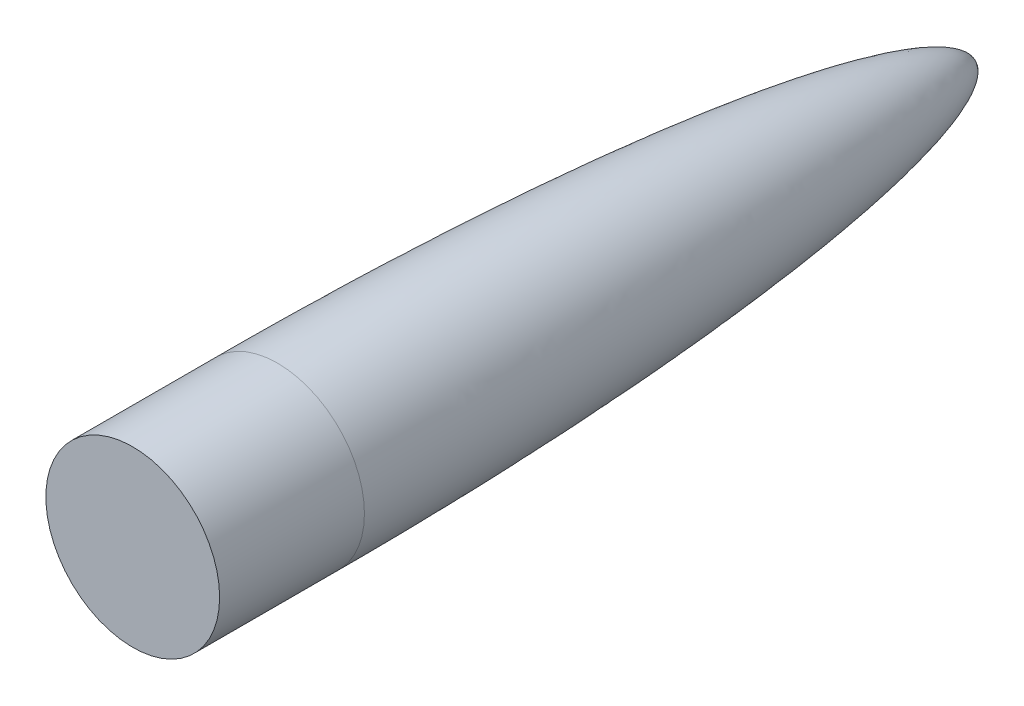
ISO-10303-21;
HEADER;
FILE_DESCRIPTION(('STEP AP214'),'2;1');
FILE_NAME('part.step','',(''),(''),'','','');
FILE_SCHEMA(('AUTOMOTIVE_DESIGN { 1 0 10303 214 1 1 1 1 }'));
ENDSEC;
DATA;
#1=APPLICATION_CONTEXT('core data for automotive mechanical design processes');
#2=APPLICATION_PROTOCOL_DEFINITION('international standard','automotive_design',2000,#1);
#3=PRODUCT_CONTEXT('',#1,'mechanical');
#4=PRODUCT('Part','Part','',(#3));
#5=PRODUCT_RELATED_PRODUCT_CATEGORY('part','',(#4));
#6=PRODUCT_DEFINITION_FORMATION('','',#4);
#7=PRODUCT_DEFINITION_CONTEXT('part definition',#1,'design');
#8=PRODUCT_DEFINITION('design','',#6,#7);
#9=PRODUCT_DEFINITION_SHAPE('','',#8);
#10=(LENGTH_UNIT() NAMED_UNIT(*) SI_UNIT(.MILLI.,.METRE.));
#11=(NAMED_UNIT(*) PLANE_ANGLE_UNIT() SI_UNIT($,.RADIAN.));
#12=(NAMED_UNIT(*) SI_UNIT($,.STERADIAN.) SOLID_ANGLE_UNIT());
#13=UNCERTAINTY_MEASURE_WITH_UNIT(LENGTH_MEASURE(1.E-05),#10,'distance_accuracy_value','');
#14=(GEOMETRIC_REPRESENTATION_CONTEXT(3) GLOBAL_UNCERTAINTY_ASSIGNED_CONTEXT((#13)) GLOBAL_UNIT_ASSIGNED_CONTEXT((#10,
#11,#12)) REPRESENTATION_CONTEXT('',''));
#15=CARTESIAN_POINT('',(0.,0.,0.));
#16=DIRECTION('',(0.,0.,1.));
#17=DIRECTION('',(1.,0.,0.));
#18=AXIS2_PLACEMENT_3D('',#15,#16,#17);
#19=CARTESIAN_POINT('',(0.,0.,127.));
#20=DIRECTION('',(0.,0.,-1.));
#21=DIRECTION('',(-1.,0.,0.));
#22=AXIS2_PLACEMENT_3D('',#19,#20,#21);
#23=CYLINDRICAL_SURFACE('',#22,76.2);
#24=CARTESIAN_POINT('',(0.,0.,127.));
#25=DIRECTION('',(0.,0.,1.));
#26=DIRECTION('',(1.,0.,0.));
#27=AXIS2_PLACEMENT_3D('',#24,#25,#26);
#28=CIRCLE('',#27,76.2);
#29=CARTESIAN_POINT('',(76.2,0.,127.));
#30=VERTEX_POINT('',#29);
#31=EDGE_CURVE('E11',#30,#30,#28,.T.);
#32=ORIENTED_EDGE('',*,*,#31,.F.);
#33=EDGE_LOOP('',(#32));
#34=FACE_BOUND('',#33,.T.);
#35=CARTESIAN_POINT('',(0.,0.,0.));
#36=DIRECTION('',(0.,0.,1.));
#37=DIRECTION('',(1.,0.,0.));
#38=AXIS2_PLACEMENT_3D('',#35,#36,#37);
#39=CIRCLE('',#38,76.2);
#40=CARTESIAN_POINT('',(76.2,0.,0.));
#41=VERTEX_POINT('',#40);
#42=EDGE_CURVE('E54',#41,#41,#39,.T.);
#43=ORIENTED_EDGE('',*,*,#42,.T.);
#44=EDGE_LOOP('',(#43));
#45=FACE_BOUND('',#44,.T.);
#46=ADVANCED_FACE('F43',(#34,#45),#23,.T.);
#47=CARTESIAN_POINT('',(0.,0.,127.));
#48=DIRECTION('',(0.,0.,1.));
#49=DIRECTION('',(1.,0.,0.));
#50=AXIS2_PLACEMENT_3D('',#47,#48,#49);
#51=PLANE('',#50);
#52=ORIENTED_EDGE('',*,*,#31,.T.);
#53=EDGE_LOOP('',(#52));
#54=FACE_BOUND('',#53,.T.);
#55=ADVANCED_FACE('F59',(#54),#51,.T.);
#56=CARTESIAN_POINT('',(0.,0.,-609.59999999998));
#57=CARTESIAN_POINT('',(0.,0.541918222288046,-609.599563682013));
#58=CARTESIAN_POINT('',(0.,1.40928344500292,-609.534112279682));
#59=CARTESIAN_POINT('',(0.,2.59488178513582,-609.297553379722));
#60=CARTESIAN_POINT('',(0.,4.06670842178637,-608.765687548509));
#61=CARTESIAN_POINT('',(0.,5.3705096311602,-608.121671404746));
#62=CARTESIAN_POINT('',(0.,6.77374346712748,-607.233296471674));
#63=CARTESIAN_POINT('',(0.,8.36519132479839,-605.978811572951));
#64=CARTESIAN_POINT('',(0.,10.2523236776625,-604.148746675796));
#65=CARTESIAN_POINT('',(0.,12.573206028367,-601.388134479486));
#66=CARTESIAN_POINT('',(0.,15.5108083755222,-597.076898443614));
#67=CARTESIAN_POINT('',(0.,19.3348976234934,-590.075652245373));
#68=CARTESIAN_POINT('',(0.,24.3295409627802,-578.458973017563));
#69=CARTESIAN_POINT('',(0.,29.4819180233033,-562.960195372493));
#70=CARTESIAN_POINT('',(0.,34.4893485141154,-544.349480809764));
#71=CARTESIAN_POINT('',(0.,39.2414980719812,-523.199490669101));
#72=CARTESIAN_POINT('',(0.,43.4017205843142,-501.685686908381));
#73=CARTESIAN_POINT('',(0.,48.1519319796488,-473.542663933327));
#74=CARTESIAN_POINT('',(0.,53.110136512241,-438.723008805628));
#75=CARTESIAN_POINT('',(0.,57.9313403880223,-397.975224102608));
#76=CARTESIAN_POINT('',(0.,62.4436331942113,-351.300725765945));
#77=CARTESIAN_POINT('',(0.,66.1515371989604,-304.556456434486));
#78=CARTESIAN_POINT('',(0.,68.7996020676518,-263.612501761027));
#79=CARTESIAN_POINT('',(0.,70.5374355893885,-231.422760315911));
#80=CARTESIAN_POINT('',(0.,71.6391896636507,-208.003647250152));
#81=CARTESIAN_POINT('',(0.,72.3983526234587,-190.43712847426));
#82=CARTESIAN_POINT('',(0.,73.0916650791409,-172.865959473757));
#83=CARTESIAN_POINT('',(0.,73.8072804433884,-152.366814588146));
#84=CARTESIAN_POINT('',(0.,74.5013072604488,-128.928201740788));
#85=CARTESIAN_POINT('',(0.,75.0031900636966,-108.426630228208));
#86=CARTESIAN_POINT('',(0.,75.3597597320351,-90.8368985210796));
#87=CARTESIAN_POINT('',(0.,75.6084778067758,-76.2017745469495));
#88=CARTESIAN_POINT('',(0.,75.7786191322438,-64.4508551044437));
#89=CARTESIAN_POINT('',(0.,75.9201195678868,-52.7854298898534));
#90=CARTESIAN_POINT('',(0.,76.0331337688016,-40.9652275149794));
#91=CARTESIAN_POINT('',(0.,76.1177870606204,-29.4176281071758));
#92=CARTESIAN_POINT('',(0.,76.167123171046,-18.8640595383187));
#93=CARTESIAN_POINT('',(0.,76.1917817803087,-10.5553152980973));
#94=CARTESIAN_POINT('',(0.,76.1988259672895,-4.02529465624266));
#95=CARTESIAN_POINT('',(0.,76.2,-1.33483912712991));
#96=CARTESIAN_POINT('',(0.,76.2,-2.0317456430153E-11));
#97=B_SPLINE_CURVE_WITH_KNOTS('',4,(#56,#57,#58,#59,#60,#61,#62,#63,#64,#65,#66,#67,#68,#69,#70,
#71,#72,#73,#74,#75,#76,#77,#78,#79,#80,#81,#82,#83,#84,#85,#86,#87,#88,#89,#90,#91,#92,#93,#94,
#95,#96),.UNSPECIFIED.,.F.,.F.,(5,1,1,1,1,1,1,1,1,1,1,1,1,1,1,1,1,1,1,1,1,1,1,1,1,1,1,1,1,1,1,1,
1,1,1,1,1,5),(0.0890271334996105,0.0921808909021446,0.0941094194147923,0.096050014912663,
0.0981486920903895,0.100659797448386,0.103793998763176,0.107866974149095,0.113478940179298,
0.121692731278193,0.134220292770916,0.154398983453017,0.187249227353428,0.217005634426561,
0.246762041499694,0.281000128150867,0.315238214802041,0.383714390429365,0.452190568168559,
0.520666746840255,0.589142925350638,0.657619103607377,0.691857193520996,0.708976238477806,
0.726095283434615,0.760333372956179,0.794571462477742,0.828809552018405,0.863047641559068,
0.880166686379804,0.89728573120054,0.914404776021276,0.931523820842012,0.948642865631509,
0.965761910421006,0.982880955210503,0.991440477605251,1.),.UNSPECIFIED.);
#98=CARTESIAN_POINT('',(0.,0.,-480.060000000396));
#99=DIRECTION('',(0.,0.,-1.));
#100=AXIS1_PLACEMENT('',#98,#99);
#101=SURFACE_OF_REVOLUTION('',#97,#100);
#102=ORIENTED_EDGE('',*,*,#42,.F.);
#103=EDGE_LOOP('',(#102));
#104=FACE_BOUND('',#103,.T.);
#105=CARTESIAN_POINT('',(0.,0.,-609.59999999998));
#106=VERTEX_POINT('',#105);
#107=VERTEX_LOOP('',#106);
#108=FACE_BOUND('',#107,.T.);
#109=ADVANCED_FACE('F45',(#104,#108),#101,.F.);
#110=CLOSED_SHELL('',(#46,#55,#109));
#111=MANIFOLD_SOLID_BREP('B2',#110);
#112=ADVANCED_BREP_SHAPE_REPRESENTATION('',(#18,#111),#14);
#113=SHAPE_DEFINITION_REPRESENTATION(#9,#112);
ENDSEC;
END-ISO-10303-21;
